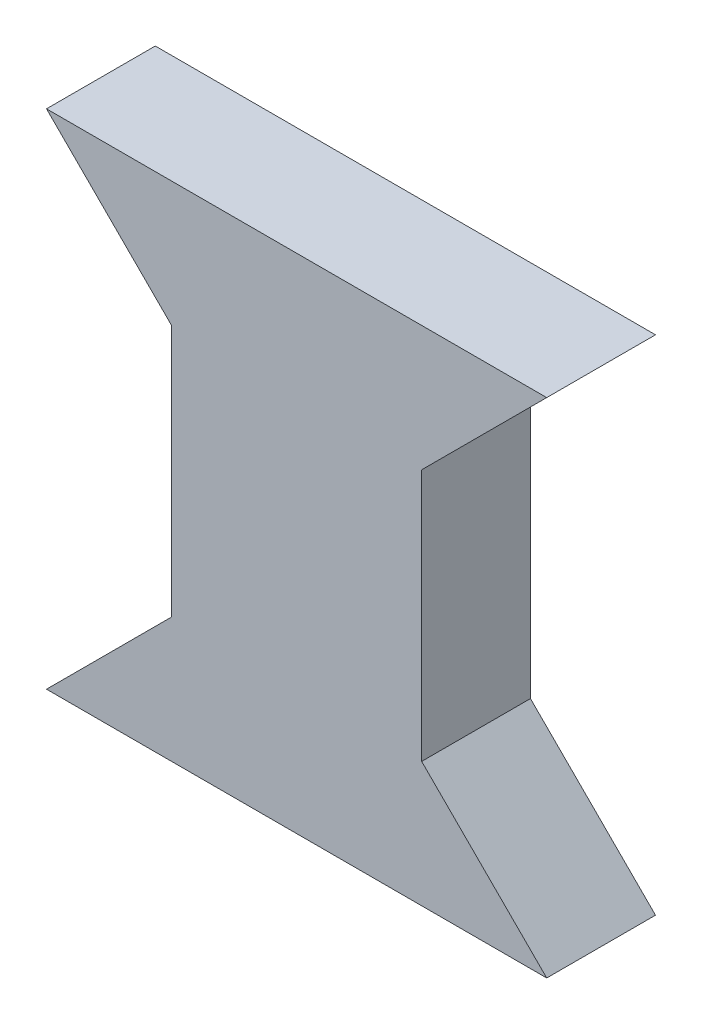
ISO-10303-21;
HEADER;
FILE_DESCRIPTION(('STEP AP214'),'2;1');
FILE_NAME('part.step','',(''),(''),'','','');
FILE_SCHEMA(('AUTOMOTIVE_DESIGN { 1 0 10303 214 1 1 1 1 }'));
ENDSEC;
DATA;
#1=APPLICATION_CONTEXT('core data for automotive mechanical design processes');
#2=APPLICATION_PROTOCOL_DEFINITION('international standard','automotive_design',2000,#1);
#3=PRODUCT_CONTEXT('',#1,'mechanical');
#4=PRODUCT('Part','Part','',(#3));
#5=PRODUCT_RELATED_PRODUCT_CATEGORY('part','',(#4));
#6=PRODUCT_DEFINITION_FORMATION('','',#4);
#7=PRODUCT_DEFINITION_CONTEXT('part definition',#1,'design');
#8=PRODUCT_DEFINITION('design','',#6,#7);
#9=PRODUCT_DEFINITION_SHAPE('','',#8);
#10=(LENGTH_UNIT() NAMED_UNIT(*) SI_UNIT(.MILLI.,.METRE.));
#11=(NAMED_UNIT(*) PLANE_ANGLE_UNIT() SI_UNIT($,.RADIAN.));
#12=(NAMED_UNIT(*) SI_UNIT($,.STERADIAN.) SOLID_ANGLE_UNIT());
#13=UNCERTAINTY_MEASURE_WITH_UNIT(LENGTH_MEASURE(1.E-05),#10,'distance_accuracy_value','');
#14=(GEOMETRIC_REPRESENTATION_CONTEXT(3) GLOBAL_UNCERTAINTY_ASSIGNED_CONTEXT((#13)) GLOBAL_UNIT_ASSIGNED_CONTEXT((#10,
#11,#12)) REPRESENTATION_CONTEXT('',''));
#15=CARTESIAN_POINT('',(0.,0.,0.));
#16=DIRECTION('',(0.,0.,1.));
#17=DIRECTION('',(1.,0.,0.));
#18=AXIS2_PLACEMENT_3D('',#15,#16,#17);
#19=CARTESIAN_POINT('',(-22.9929009164314,24.9316203143893,10.));
#20=DIRECTION('',(0.707106781186544,0.707106781186551,0.));
#21=DIRECTION('',(-0.707106781186551,0.707106781186544,0.));
#22=AXIS2_PLACEMENT_3D('',#19,#20,#21);
#23=PLANE('',#22);
#24=DIRECTION('',(0.707106781186551,-0.707106781186544,0.));
#25=VECTOR('',#24,1.);
#26=CARTESIAN_POINT('',(-22.9929009164314,24.9316203143893,0.));
#27=LINE('',#26,#25);
#28=CARTESIAN_POINT('',(-22.9929009164314,24.9316203143893,0.));
#29=VERTEX_POINT('',#28);
#30=CARTESIAN_POINT('',(-11.4964504582157,13.4351698561738,0.));
#31=VERTEX_POINT('',#30);
#32=EDGE_CURVE('E133',#29,#31,#27,.T.);
#33=ORIENTED_EDGE('',*,*,#32,.T.);
#34=DIRECTION('',(0.,0.,-1.));
#35=VECTOR('',#34,1.);
#36=CARTESIAN_POINT('',(-11.4964504582157,13.4351698561738,10.));
#37=LINE('',#36,#35);
#38=CARTESIAN_POINT('',(-11.4964504582157,13.4351698561738,10.));
#39=VERTEX_POINT('',#38);
#40=EDGE_CURVE('E11',#39,#31,#37,.T.);
#41=ORIENTED_EDGE('',*,*,#40,.F.);
#42=DIRECTION('',(0.707106781186551,-0.707106781186544,0.));
#43=VECTOR('',#42,1.);
#44=CARTESIAN_POINT('',(-22.9929009164314,24.9316203143893,10.));
#45=LINE('',#44,#43);
#46=CARTESIAN_POINT('',(-22.9929009164314,24.9316203143893,10.));
#47=VERTEX_POINT('',#46);
#48=EDGE_CURVE('E147',#47,#39,#45,.T.);
#49=ORIENTED_EDGE('',*,*,#48,.F.);
#50=DIRECTION('',(0.,0.,-1.));
#51=VECTOR('',#50,1.);
#52=CARTESIAN_POINT('',(-22.9929009164314,24.9316203143893,10.));
#53=LINE('',#52,#51);
#54=EDGE_CURVE('E129',#47,#29,#53,.T.);
#55=ORIENTED_EDGE('',*,*,#54,.T.);
#56=EDGE_LOOP('',(#33,#41,#49,#55));
#57=FACE_BOUND('',#56,.T.);
#58=ADVANCED_FACE('F37',(#57),#23,.F.);
#59=CARTESIAN_POINT('',(-11.4964504582157,13.4351698561738,10.));
#60=DIRECTION('',(1.,0.,0.));
#61=DIRECTION('',(0.,0.,-1.));
#62=AXIS2_PLACEMENT_3D('',#59,#60,#61);
#63=PLANE('',#62);
#64=DIRECTION('',(0.,-1.,0.));
#65=VECTOR('',#64,1.);
#66=CARTESIAN_POINT('',(-11.4964504582157,13.4351698561738,0.));
#67=LINE('',#66,#65);
#68=CARTESIAN_POINT('',(-11.4964504582157,-9.78027263731041,0.));
#69=VERTEX_POINT('',#68);
#70=EDGE_CURVE('E136',#31,#69,#67,.T.);
#71=ORIENTED_EDGE('',*,*,#70,.T.);
#72=DIRECTION('',(0.,0.,-1.));
#73=VECTOR('',#72,1.);
#74=CARTESIAN_POINT('',(-11.4964504582157,-9.78027263731041,10.));
#75=LINE('',#74,#73);
#76=CARTESIAN_POINT('',(-11.4964504582157,-9.78027263731041,10.));
#77=VERTEX_POINT('',#76);
#78=EDGE_CURVE('E45',#77,#69,#75,.T.);
#79=ORIENTED_EDGE('',*,*,#78,.F.);
#80=DIRECTION('',(0.,-1.,0.));
#81=VECTOR('',#80,1.);
#82=CARTESIAN_POINT('',(-11.4964504582157,13.4351698561738,10.));
#83=LINE('',#82,#81);
#84=EDGE_CURVE('E96',#39,#77,#83,.T.);
#85=ORIENTED_EDGE('',*,*,#84,.F.);
#86=ORIENTED_EDGE('',*,*,#40,.T.);
#87=EDGE_LOOP('',(#71,#79,#85,#86));
#88=FACE_BOUND('',#87,.T.);
#89=ADVANCED_FACE('F182',(#88),#63,.F.);
#90=CARTESIAN_POINT('',(-22.9929009164314,-21.276723095526,10.));
#91=DIRECTION('',(0.707106781186544,-0.707106781186551,0.));
#92=DIRECTION('',(0.707106781186551,0.707106781186544,0.));
#93=AXIS2_PLACEMENT_3D('',#90,#91,#92);
#94=PLANE('',#93);
#95=DIRECTION('',(-0.707106781186551,-0.707106781186544,0.));
#96=VECTOR('',#95,1.);
#97=CARTESIAN_POINT('',(-22.9929009164314,-21.276723095526,0.));
#98=LINE('',#97,#96);
#99=CARTESIAN_POINT('',(-22.9929009164314,-21.276723095526,0.));
#100=VERTEX_POINT('',#99);
#101=EDGE_CURVE('E138',#69,#100,#98,.T.);
#102=ORIENTED_EDGE('',*,*,#101,.T.);
#103=DIRECTION('',(0.,0.,-1.));
#104=VECTOR('',#103,1.);
#105=CARTESIAN_POINT('',(-22.9929009164314,-21.276723095526,10.));
#106=LINE('',#105,#104);
#107=CARTESIAN_POINT('',(-22.9929009164314,-21.276723095526,10.));
#108=VERTEX_POINT('',#107);
#109=EDGE_CURVE('E154',#108,#100,#106,.T.);
#110=ORIENTED_EDGE('',*,*,#109,.F.);
#111=DIRECTION('',(-0.707106781186551,-0.707106781186544,0.));
#112=VECTOR('',#111,1.);
#113=CARTESIAN_POINT('',(-22.9929009164314,-21.276723095526,10.));
#114=LINE('',#113,#112);
#115=EDGE_CURVE('E162',#77,#108,#114,.T.);
#116=ORIENTED_EDGE('',*,*,#115,.F.);
#117=ORIENTED_EDGE('',*,*,#78,.T.);
#118=EDGE_LOOP('',(#102,#110,#116,#117));
#119=FACE_BOUND('',#118,.T.);
#120=ADVANCED_FACE('F160',(#119),#94,.F.);
#121=CARTESIAN_POINT('',(22.9929009164314,-21.276723095526,10.));
#122=DIRECTION('',(0.,1.,0.));
#123=DIRECTION('',(0.,0.,1.));
#124=AXIS2_PLACEMENT_3D('',#121,#122,#123);
#125=PLANE('',#124);
#126=DIRECTION('',(1.,0.,0.));
#127=VECTOR('',#126,1.);
#128=CARTESIAN_POINT('',(22.9929009164314,-21.276723095526,0.));
#129=LINE('',#128,#127);
#130=CARTESIAN_POINT('',(22.9929009164314,-21.276723095526,0.));
#131=VERTEX_POINT('',#130);
#132=EDGE_CURVE('E140',#100,#131,#129,.T.);
#133=ORIENTED_EDGE('',*,*,#132,.T.);
#134=DIRECTION('',(0.,0.,-1.));
#135=VECTOR('',#134,1.);
#136=CARTESIAN_POINT('',(22.9929009164314,-21.276723095526,10.));
#137=LINE('',#136,#135);
#138=CARTESIAN_POINT('',(22.9929009164314,-21.276723095526,10.));
#139=VERTEX_POINT('',#138);
#140=EDGE_CURVE('E151',#139,#131,#137,.T.);
#141=ORIENTED_EDGE('',*,*,#140,.F.);
#142=DIRECTION('',(1.,0.,0.));
#143=VECTOR('',#142,1.);
#144=CARTESIAN_POINT('',(22.9929009164314,-21.276723095526,10.));
#145=LINE('',#144,#143);
#146=EDGE_CURVE('E174',#108,#139,#145,.T.);
#147=ORIENTED_EDGE('',*,*,#146,.F.);
#148=ORIENTED_EDGE('',*,*,#109,.T.);
#149=EDGE_LOOP('',(#133,#141,#147,#148));
#150=FACE_BOUND('',#149,.T.);
#151=ADVANCED_FACE('F170',(#150),#125,.F.);
#152=CARTESIAN_POINT('',(22.9929009164314,-21.276723095526,10.));
#153=DIRECTION('',(-0.707106781186544,-0.707106781186551,0.));
#154=DIRECTION('',(0.707106781186551,-0.707106781186544,0.));
#155=AXIS2_PLACEMENT_3D('',#152,#153,#154);
#156=PLANE('',#155);
#157=DIRECTION('',(-0.707106781186551,0.707106781186544,0.));
#158=VECTOR('',#157,1.);
#159=CARTESIAN_POINT('',(22.9929009164314,-21.276723095526,0.));
#160=LINE('',#159,#158);
#161=CARTESIAN_POINT('',(11.4964504582157,-9.78027263731041,0.));
#162=VERTEX_POINT('',#161);
#163=EDGE_CURVE('E142',#131,#162,#160,.T.);
#164=ORIENTED_EDGE('',*,*,#163,.T.);
#165=DIRECTION('',(0.,0.,-1.));
#166=VECTOR('',#165,1.);
#167=CARTESIAN_POINT('',(11.4964504582157,-9.78027263731041,10.));
#168=LINE('',#167,#166);
#169=CARTESIAN_POINT('',(11.4964504582157,-9.78027263731041,10.));
#170=VERTEX_POINT('',#169);
#171=EDGE_CURVE('E124',#170,#162,#168,.T.);
#172=ORIENTED_EDGE('',*,*,#171,.F.);
#173=DIRECTION('',(-0.707106781186551,0.707106781186544,0.));
#174=VECTOR('',#173,1.);
#175=CARTESIAN_POINT('',(22.9929009164314,-21.276723095526,10.));
#176=LINE('',#175,#174);
#177=EDGE_CURVE('E115',#139,#170,#176,.T.);
#178=ORIENTED_EDGE('',*,*,#177,.F.);
#179=ORIENTED_EDGE('',*,*,#140,.T.);
#180=EDGE_LOOP('',(#164,#172,#178,#179));
#181=FACE_BOUND('',#180,.T.);
#182=ADVANCED_FACE('F173',(#181),#156,.F.);
#183=CARTESIAN_POINT('',(11.4964504582157,13.4351698561738,10.));
#184=DIRECTION('',(-1.,0.,0.));
#185=DIRECTION('',(0.,0.,1.));
#186=AXIS2_PLACEMENT_3D('',#183,#184,#185);
#187=PLANE('',#186);
#188=DIRECTION('',(0.,1.,0.));
#189=VECTOR('',#188,1.);
#190=CARTESIAN_POINT('',(11.4964504582157,13.4351698561738,0.));
#191=LINE('',#190,#189);
#192=CARTESIAN_POINT('',(11.4964504582157,13.4351698561738,0.));
#193=VERTEX_POINT('',#192);
#194=EDGE_CURVE('E123',#162,#193,#191,.T.);
#195=ORIENTED_EDGE('',*,*,#194,.T.);
#196=DIRECTION('',(0.,0.,-1.));
#197=VECTOR('',#196,1.);
#198=CARTESIAN_POINT('',(11.4964504582157,13.4351698561738,10.));
#199=LINE('',#198,#197);
#200=CARTESIAN_POINT('',(11.4964504582157,13.4351698561738,10.));
#201=VERTEX_POINT('',#200);
#202=EDGE_CURVE('E120',#201,#193,#199,.T.);
#203=ORIENTED_EDGE('',*,*,#202,.F.);
#204=DIRECTION('',(0.,1.,0.));
#205=VECTOR('',#204,1.);
#206=CARTESIAN_POINT('',(11.4964504582157,13.4351698561738,10.));
#207=LINE('',#206,#205);
#208=EDGE_CURVE('E109',#170,#201,#207,.T.);
#209=ORIENTED_EDGE('',*,*,#208,.F.);
#210=ORIENTED_EDGE('',*,*,#171,.T.);
#211=EDGE_LOOP('',(#195,#203,#209,#210));
#212=FACE_BOUND('',#211,.T.);
#213=ADVANCED_FACE('F121',(#212),#187,.F.);
#214=CARTESIAN_POINT('',(22.9929009164314,24.9316203143893,10.));
#215=DIRECTION('',(-0.707106781186544,0.707106781186551,0.));
#216=DIRECTION('',(-0.707106781186551,-0.707106781186544,0.));
#217=AXIS2_PLACEMENT_3D('',#214,#215,#216);
#218=PLANE('',#217);
#219=DIRECTION('',(0.707106781186551,0.707106781186544,0.));
#220=VECTOR('',#219,1.);
#221=CARTESIAN_POINT('',(22.9929009164314,24.9316203143893,0.));
#222=LINE('',#221,#220);
#223=CARTESIAN_POINT('',(22.9929009164314,24.9316203143893,0.));
#224=VERTEX_POINT('',#223);
#225=EDGE_CURVE('E82',#193,#224,#222,.T.);
#226=ORIENTED_EDGE('',*,*,#225,.T.);
#227=DIRECTION('',(0.,0.,-1.));
#228=VECTOR('',#227,1.);
#229=CARTESIAN_POINT('',(22.9929009164314,24.9316203143893,10.));
#230=LINE('',#229,#228);
#231=CARTESIAN_POINT('',(22.9929009164314,24.9316203143893,10.));
#232=VERTEX_POINT('',#231);
#233=EDGE_CURVE('E125',#232,#224,#230,.T.);
#234=ORIENTED_EDGE('',*,*,#233,.F.);
#235=DIRECTION('',(0.707106781186551,0.707106781186544,0.));
#236=VECTOR('',#235,1.);
#237=CARTESIAN_POINT('',(22.9929009164314,24.9316203143893,10.));
#238=LINE('',#237,#236);
#239=EDGE_CURVE('E113',#201,#232,#238,.T.);
#240=ORIENTED_EDGE('',*,*,#239,.F.);
#241=ORIENTED_EDGE('',*,*,#202,.T.);
#242=EDGE_LOOP('',(#226,#234,#240,#241));
#243=FACE_BOUND('',#242,.T.);
#244=ADVANCED_FACE('F127',(#243),#218,.F.);
#245=CARTESIAN_POINT('',(22.9929009164314,24.9316203143893,10.));
#246=DIRECTION('',(0.,-1.,0.));
#247=DIRECTION('',(0.,0.,-1.));
#248=AXIS2_PLACEMENT_3D('',#245,#246,#247);
#249=PLANE('',#248);
#250=DIRECTION('',(-1.,0.,0.));
#251=VECTOR('',#250,1.);
#252=CARTESIAN_POINT('',(22.9929009164314,24.9316203143893,0.));
#253=LINE('',#252,#251);
#254=EDGE_CURVE('E88',#224,#29,#253,.T.);
#255=ORIENTED_EDGE('',*,*,#254,.T.);
#256=ORIENTED_EDGE('',*,*,#54,.F.);
#257=DIRECTION('',(-1.,0.,0.));
#258=VECTOR('',#257,1.);
#259=CARTESIAN_POINT('',(22.9929009164314,24.9316203143893,10.));
#260=LINE('',#259,#258);
#261=EDGE_CURVE('E53',#232,#47,#260,.T.);
#262=ORIENTED_EDGE('',*,*,#261,.F.);
#263=ORIENTED_EDGE('',*,*,#233,.T.);
#264=EDGE_LOOP('',(#255,#256,#262,#263));
#265=FACE_BOUND('',#264,.T.);
#266=ADVANCED_FACE('F198',(#265),#249,.F.);
#267=CARTESIAN_POINT('',(0.,0.,10.));
#268=DIRECTION('',(0.,0.,1.));
#269=DIRECTION('',(1.,0.,0.));
#270=AXIS2_PLACEMENT_3D('',#267,#268,#269);
#271=PLANE('',#270);
#272=ORIENTED_EDGE('',*,*,#48,.T.);
#273=ORIENTED_EDGE('',*,*,#84,.T.);
#274=ORIENTED_EDGE('',*,*,#115,.T.);
#275=ORIENTED_EDGE('',*,*,#146,.T.);
#276=ORIENTED_EDGE('',*,*,#177,.T.);
#277=ORIENTED_EDGE('',*,*,#208,.T.);
#278=ORIENTED_EDGE('',*,*,#239,.T.);
#279=ORIENTED_EDGE('',*,*,#261,.T.);
#280=EDGE_LOOP('',(#272,#273,#274,#275,#276,#277,#278,#279));
#281=FACE_BOUND('',#280,.T.);
#282=ADVANCED_FACE('F111',(#281),#271,.T.);
#283=CARTESIAN_POINT('',(0.,0.,0.));
#284=DIRECTION('',(0.,0.,1.));
#285=DIRECTION('',(1.,0.,0.));
#286=AXIS2_PLACEMENT_3D('',#283,#284,#285);
#287=PLANE('',#286);
#288=ORIENTED_EDGE('',*,*,#32,.F.);
#289=ORIENTED_EDGE('',*,*,#254,.F.);
#290=ORIENTED_EDGE('',*,*,#225,.F.);
#291=ORIENTED_EDGE('',*,*,#194,.F.);
#292=ORIENTED_EDGE('',*,*,#163,.F.);
#293=ORIENTED_EDGE('',*,*,#132,.F.);
#294=ORIENTED_EDGE('',*,*,#101,.F.);
#295=ORIENTED_EDGE('',*,*,#70,.F.);
#296=EDGE_LOOP('',(#288,#289,#290,#291,#292,#293,#294,#295));
#297=FACE_BOUND('',#296,.T.);
#298=ADVANCED_FACE('F166',(#297),#287,.F.);
#299=CLOSED_SHELL('',(#58,#89,#120,#151,#182,#213,#244,#266,#282,#298));
#300=MANIFOLD_SOLID_BREP('B2',#299);
#301=ADVANCED_BREP_SHAPE_REPRESENTATION('',(#18,#300),#14);
#302=SHAPE_DEFINITION_REPRESENTATION(#9,#301);
ENDSEC;
END-ISO-10303-21;
